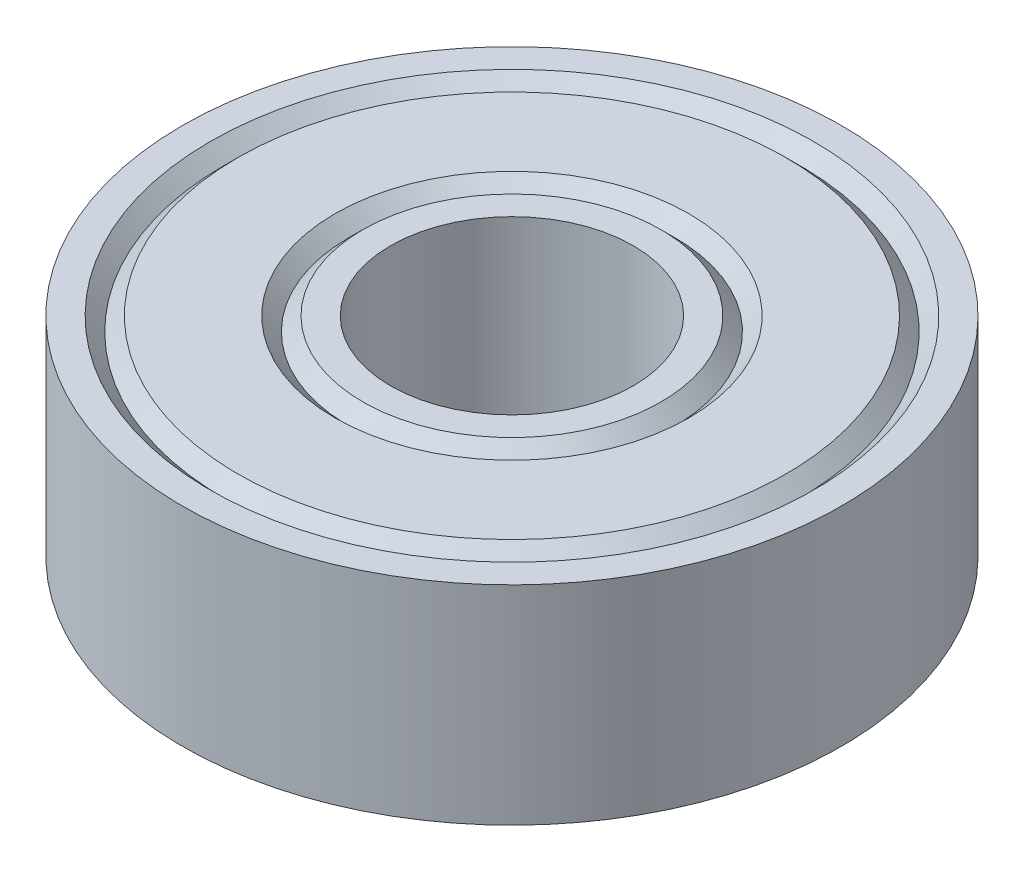
ISO-10303-21;
HEADER;
FILE_DESCRIPTION(('STEP AP214'),'2;1');
FILE_NAME('part.step','',(''),(''),'','','');
FILE_SCHEMA(('AUTOMOTIVE_DESIGN { 1 0 10303 214 1 1 1 1 }'));
ENDSEC;
DATA;
#1=APPLICATION_CONTEXT('core data for automotive mechanical design processes');
#2=APPLICATION_PROTOCOL_DEFINITION('international standard','automotive_design',2000,#1);
#3=PRODUCT_CONTEXT('',#1,'mechanical');
#4=PRODUCT('Part','Part','',(#3));
#5=PRODUCT_RELATED_PRODUCT_CATEGORY('part','',(#4));
#6=PRODUCT_DEFINITION_FORMATION('','',#4);
#7=PRODUCT_DEFINITION_CONTEXT('part definition',#1,'design');
#8=PRODUCT_DEFINITION('design','',#6,#7);
#9=PRODUCT_DEFINITION_SHAPE('','',#8);
#10=(LENGTH_UNIT() NAMED_UNIT(*) SI_UNIT(.MILLI.,.METRE.));
#11=(NAMED_UNIT(*) PLANE_ANGLE_UNIT() SI_UNIT($,.RADIAN.));
#12=(NAMED_UNIT(*) SI_UNIT($,.STERADIAN.) SOLID_ANGLE_UNIT());
#13=UNCERTAINTY_MEASURE_WITH_UNIT(LENGTH_MEASURE(1.E-05),#10,'distance_accuracy_value','');
#14=(GEOMETRIC_REPRESENTATION_CONTEXT(3) GLOBAL_UNCERTAINTY_ASSIGNED_CONTEXT((#13)) GLOBAL_UNIT_ASSIGNED_CONTEXT((#10,
#11,#12)) REPRESENTATION_CONTEXT('',''));
#15=CARTESIAN_POINT('',(0.,0.,0.));
#16=DIRECTION('',(0.,0.,1.));
#17=DIRECTION('',(1.,0.,0.));
#18=AXIS2_PLACEMENT_3D('',#15,#16,#17);
#19=CARTESIAN_POINT('',(0.,3.,0.));
#20=DIRECTION('',(0.,1.,0.));
#21=DIRECTION('',(-1.,0.,0.));
#22=AXIS2_PLACEMENT_3D('',#19,#20,#21);
#23=CYLINDRICAL_SURFACE('',#22,3.5);
#24=CARTESIAN_POINT('',(0.,3.,0.));
#25=DIRECTION('',(0.,1.,0.));
#26=DIRECTION('',(-1.,0.,0.));
#27=AXIS2_PLACEMENT_3D('',#24,#25,#26);
#28=CIRCLE('',#27,3.5);
#29=CARTESIAN_POINT('',(-3.5,3.,0.));
#30=VERTEX_POINT('',#29);
#31=EDGE_CURVE('E83',#30,#30,#28,.T.);
#32=ORIENTED_EDGE('',*,*,#31,.T.);
#33=EDGE_LOOP('',(#32));
#34=FACE_BOUND('',#33,.T.);
#35=CARTESIAN_POINT('',(0.,-3.,0.));
#36=DIRECTION('',(0.,1.,0.));
#37=DIRECTION('',(-1.,0.,0.));
#38=AXIS2_PLACEMENT_3D('',#35,#36,#37);
#39=CIRCLE('',#38,3.5);
#40=CARTESIAN_POINT('',(-3.5,-3.,0.));
#41=VERTEX_POINT('',#40);
#42=EDGE_CURVE('E10',#41,#41,#39,.T.);
#43=ORIENTED_EDGE('',*,*,#42,.F.);
#44=EDGE_LOOP('',(#43));
#45=FACE_BOUND('',#44,.T.);
#46=ADVANCED_FACE('F31',(#34,#45),#23,.F.);
#47=CARTESIAN_POINT('',(-3.5,-3.,0.));
#48=DIRECTION('',(0.,-1.,0.));
#49=DIRECTION('',(1.,0.,0.));
#50=AXIS2_PLACEMENT_3D('',#47,#48,#49);
#51=PLANE('',#50);
#52=ORIENTED_EDGE('',*,*,#42,.T.);
#53=EDGE_LOOP('',(#52));
#54=FACE_BOUND('',#53,.T.);
#55=CARTESIAN_POINT('',(0.,-3.,0.));
#56=DIRECTION('',(0.,1.,0.));
#57=DIRECTION('',(-1.,0.,0.));
#58=AXIS2_PLACEMENT_3D('',#55,#56,#57);
#59=CIRCLE('',#58,4.3);
#60=CARTESIAN_POINT('',(-4.3,-3.,0.));
#61=VERTEX_POINT('',#60);
#62=EDGE_CURVE('E37',#61,#61,#59,.T.);
#63=ORIENTED_EDGE('',*,*,#62,.F.);
#64=EDGE_LOOP('',(#63));
#65=FACE_BOUND('',#64,.T.);
#66=ADVANCED_FACE('F101',(#54,#65),#51,.T.);
#67=CARTESIAN_POINT('',(0.,-2.6,0.));
#68=DIRECTION('',(0.,1.,0.));
#69=DIRECTION('',(-1.,0.,0.));
#70=AXIS2_PLACEMENT_3D('',#67,#68,#69);
#71=CONICAL_SURFACE('',#70,4.7,0.785398163397449);
#72=ORIENTED_EDGE('',*,*,#62,.T.);
#73=EDGE_LOOP('',(#72));
#74=FACE_BOUND('',#73,.T.);
#75=CARTESIAN_POINT('',(0.,-2.6,0.));
#76=DIRECTION('',(0.,1.,0.));
#77=DIRECTION('',(-1.,0.,0.));
#78=AXIS2_PLACEMENT_3D('',#75,#76,#77);
#79=CIRCLE('',#78,4.7);
#80=CARTESIAN_POINT('',(-4.7,-2.6,0.));
#81=VERTEX_POINT('',#80);
#82=EDGE_CURVE('E41',#81,#81,#79,.T.);
#83=ORIENTED_EDGE('',*,*,#82,.F.);
#84=EDGE_LOOP('',(#83));
#85=FACE_BOUND('',#84,.T.);
#86=ADVANCED_FACE('F105',(#74,#85),#71,.T.);
#87=CARTESIAN_POINT('',(0.,-3.,0.));
#88=DIRECTION('',(0.,-1.,0.));
#89=DIRECTION('',(1.,0.,0.));
#90=AXIS2_PLACEMENT_3D('',#87,#88,#89);
#91=CONICAL_SURFACE('',#90,5.1,0.785398163397447);
#92=ORIENTED_EDGE('',*,*,#82,.T.);
#93=EDGE_LOOP('',(#92));
#94=FACE_BOUND('',#93,.T.);
#95=CARTESIAN_POINT('',(0.,-3.,0.));
#96=DIRECTION('',(0.,1.,0.));
#97=DIRECTION('',(-1.,0.,0.));
#98=AXIS2_PLACEMENT_3D('',#95,#96,#97);
#99=CIRCLE('',#98,5.1);
#100=CARTESIAN_POINT('',(-5.1,-3.,0.));
#101=VERTEX_POINT('',#100);
#102=EDGE_CURVE('E45',#101,#101,#99,.T.);
#103=ORIENTED_EDGE('',*,*,#102,.F.);
#104=EDGE_LOOP('',(#103));
#105=FACE_BOUND('',#104,.T.);
#106=ADVANCED_FACE('F109',(#94,#105),#91,.F.);
#107=CARTESIAN_POINT('',(-5.1,-3.,0.));
#108=DIRECTION('',(0.,-1.,0.));
#109=DIRECTION('',(1.,0.,0.));
#110=AXIS2_PLACEMENT_3D('',#107,#108,#109);
#111=PLANE('',#110);
#112=ORIENTED_EDGE('',*,*,#102,.T.);
#113=EDGE_LOOP('',(#112));
#114=FACE_BOUND('',#113,.T.);
#115=CARTESIAN_POINT('',(0.,-3.,0.));
#116=DIRECTION('',(0.,1.,0.));
#117=DIRECTION('',(-1.,0.,0.));
#118=AXIS2_PLACEMENT_3D('',#115,#116,#117);
#119=CIRCLE('',#118,7.9);
#120=CARTESIAN_POINT('',(-7.9,-3.,0.));
#121=VERTEX_POINT('',#120);
#122=EDGE_CURVE('E50',#121,#121,#119,.T.);
#123=ORIENTED_EDGE('',*,*,#122,.F.);
#124=EDGE_LOOP('',(#123));
#125=FACE_BOUND('',#124,.T.);
#126=ADVANCED_FACE('F115',(#114,#125),#111,.T.);
#127=CARTESIAN_POINT('',(0.,-2.6,0.));
#128=DIRECTION('',(0.,1.,0.));
#129=DIRECTION('',(-1.,0.,0.));
#130=AXIS2_PLACEMENT_3D('',#127,#128,#129);
#131=CONICAL_SURFACE('',#130,8.3,0.785398163397453);
#132=ORIENTED_EDGE('',*,*,#122,.T.);
#133=EDGE_LOOP('',(#132));
#134=FACE_BOUND('',#133,.T.);
#135=CARTESIAN_POINT('',(0.,-2.6,0.));
#136=DIRECTION('',(0.,1.,0.));
#137=DIRECTION('',(-1.,0.,0.));
#138=AXIS2_PLACEMENT_3D('',#135,#136,#137);
#139=CIRCLE('',#138,8.3);
#140=CARTESIAN_POINT('',(-8.3,-2.6,0.));
#141=VERTEX_POINT('',#140);
#142=EDGE_CURVE('E53',#141,#141,#139,.T.);
#143=ORIENTED_EDGE('',*,*,#142,.F.);
#144=EDGE_LOOP('',(#143));
#145=FACE_BOUND('',#144,.T.);
#146=ADVANCED_FACE('F119',(#134,#145),#131,.T.);
#147=CARTESIAN_POINT('',(0.,-3.,0.));
#148=DIRECTION('',(0.,-1.,0.));
#149=DIRECTION('',(1.,0.,0.));
#150=AXIS2_PLACEMENT_3D('',#147,#148,#149);
#151=CONICAL_SURFACE('',#150,8.69999999999999,0.785398163397445);
#152=ORIENTED_EDGE('',*,*,#142,.T.);
#153=EDGE_LOOP('',(#152));
#154=FACE_BOUND('',#153,.T.);
#155=CARTESIAN_POINT('',(0.,-3.,0.));
#156=DIRECTION('',(0.,1.,0.));
#157=DIRECTION('',(-1.,0.,0.));
#158=AXIS2_PLACEMENT_3D('',#155,#156,#157);
#159=CIRCLE('',#158,8.7);
#160=CARTESIAN_POINT('',(-8.7,-3.,0.));
#161=VERTEX_POINT('',#160);
#162=EDGE_CURVE('E56',#161,#161,#159,.T.);
#163=ORIENTED_EDGE('',*,*,#162,.F.);
#164=EDGE_LOOP('',(#163));
#165=FACE_BOUND('',#164,.T.);
#166=ADVANCED_FACE('F123',(#154,#165),#151,.F.);
#167=CARTESIAN_POINT('',(-8.7,-3.,0.));
#168=DIRECTION('',(0.,-1.,0.));
#169=DIRECTION('',(1.,0.,0.));
#170=AXIS2_PLACEMENT_3D('',#167,#168,#169);
#171=PLANE('',#170);
#172=ORIENTED_EDGE('',*,*,#162,.T.);
#173=EDGE_LOOP('',(#172));
#174=FACE_BOUND('',#173,.T.);
#175=CARTESIAN_POINT('',(0.,-3.,0.));
#176=DIRECTION('',(0.,1.,0.));
#177=DIRECTION('',(-1.,0.,0.));
#178=AXIS2_PLACEMENT_3D('',#175,#176,#177);
#179=CIRCLE('',#178,9.5);
#180=CARTESIAN_POINT('',(-9.5,-3.,0.));
#181=VERTEX_POINT('',#180);
#182=EDGE_CURVE('E59',#181,#181,#179,.T.);
#183=ORIENTED_EDGE('',*,*,#182,.F.);
#184=EDGE_LOOP('',(#183));
#185=FACE_BOUND('',#184,.T.);
#186=ADVANCED_FACE('F127',(#174,#185),#171,.T.);
#187=CARTESIAN_POINT('',(0.,3.,0.));
#188=DIRECTION('',(0.,1.,0.));
#189=DIRECTION('',(-1.,0.,0.));
#190=AXIS2_PLACEMENT_3D('',#187,#188,#189);
#191=CYLINDRICAL_SURFACE('',#190,9.49999999999999);
#192=ORIENTED_EDGE('',*,*,#182,.T.);
#193=EDGE_LOOP('',(#192));
#194=FACE_BOUND('',#193,.T.);
#195=CARTESIAN_POINT('',(0.,3.,0.));
#196=DIRECTION('',(0.,1.,0.));
#197=DIRECTION('',(-1.,0.,0.));
#198=AXIS2_PLACEMENT_3D('',#195,#196,#197);
#199=CIRCLE('',#198,9.5);
#200=CARTESIAN_POINT('',(-9.5,3.,0.));
#201=VERTEX_POINT('',#200);
#202=EDGE_CURVE('E62',#201,#201,#199,.T.);
#203=ORIENTED_EDGE('',*,*,#202,.F.);
#204=EDGE_LOOP('',(#203));
#205=FACE_BOUND('',#204,.T.);
#206=ADVANCED_FACE('F131',(#194,#205),#191,.T.);
#207=CARTESIAN_POINT('',(-8.7,3.,0.));
#208=DIRECTION('',(0.,1.,0.));
#209=DIRECTION('',(-1.,0.,0.));
#210=AXIS2_PLACEMENT_3D('',#207,#208,#209);
#211=PLANE('',#210);
#212=ORIENTED_EDGE('',*,*,#202,.T.);
#213=EDGE_LOOP('',(#212));
#214=FACE_BOUND('',#213,.T.);
#215=CARTESIAN_POINT('',(0.,3.,0.));
#216=DIRECTION('',(0.,1.,0.));
#217=DIRECTION('',(-1.,0.,0.));
#218=AXIS2_PLACEMENT_3D('',#215,#216,#217);
#219=CIRCLE('',#218,8.7);
#220=CARTESIAN_POINT('',(-8.7,3.,0.));
#221=VERTEX_POINT('',#220);
#222=EDGE_CURVE('E65',#221,#221,#219,.T.);
#223=ORIENTED_EDGE('',*,*,#222,.F.);
#224=EDGE_LOOP('',(#223));
#225=FACE_BOUND('',#224,.T.);
#226=ADVANCED_FACE('F135',(#214,#225),#211,.T.);
#227=CARTESIAN_POINT('',(0.,2.6,0.));
#228=DIRECTION('',(0.,1.,0.));
#229=DIRECTION('',(-1.,0.,0.));
#230=AXIS2_PLACEMENT_3D('',#227,#228,#229);
#231=CONICAL_SURFACE('',#230,8.3,0.785398163397447);
#232=ORIENTED_EDGE('',*,*,#222,.T.);
#233=EDGE_LOOP('',(#232));
#234=FACE_BOUND('',#233,.T.);
#235=CARTESIAN_POINT('',(0.,2.6,0.));
#236=DIRECTION('',(0.,1.,0.));
#237=DIRECTION('',(-1.,0.,0.));
#238=AXIS2_PLACEMENT_3D('',#235,#236,#237);
#239=CIRCLE('',#238,8.3);
#240=CARTESIAN_POINT('',(-8.3,2.6,0.));
#241=VERTEX_POINT('',#240);
#242=EDGE_CURVE('E68',#241,#241,#239,.T.);
#243=ORIENTED_EDGE('',*,*,#242,.F.);
#244=EDGE_LOOP('',(#243));
#245=FACE_BOUND('',#244,.T.);
#246=ADVANCED_FACE('F139',(#234,#245),#231,.F.);
#247=CARTESIAN_POINT('',(0.,3.,0.));
#248=DIRECTION('',(0.,-1.,0.));
#249=DIRECTION('',(1.,0.,0.));
#250=AXIS2_PLACEMENT_3D('',#247,#248,#249);
#251=CONICAL_SURFACE('',#250,7.9,0.785398163397449);
#252=ORIENTED_EDGE('',*,*,#242,.T.);
#253=EDGE_LOOP('',(#252));
#254=FACE_BOUND('',#253,.T.);
#255=CARTESIAN_POINT('',(0.,3.,0.));
#256=DIRECTION('',(0.,1.,0.));
#257=DIRECTION('',(-1.,0.,0.));
#258=AXIS2_PLACEMENT_3D('',#255,#256,#257);
#259=CIRCLE('',#258,7.9);
#260=CARTESIAN_POINT('',(-7.9,3.,0.));
#261=VERTEX_POINT('',#260);
#262=EDGE_CURVE('E71',#261,#261,#259,.T.);
#263=ORIENTED_EDGE('',*,*,#262,.F.);
#264=EDGE_LOOP('',(#263));
#265=FACE_BOUND('',#264,.T.);
#266=ADVANCED_FACE('F143',(#254,#265),#251,.T.);
#267=CARTESIAN_POINT('',(-5.1,3.,0.));
#268=DIRECTION('',(0.,1.,0.));
#269=DIRECTION('',(-1.,0.,0.));
#270=AXIS2_PLACEMENT_3D('',#267,#268,#269);
#271=PLANE('',#270);
#272=ORIENTED_EDGE('',*,*,#262,.T.);
#273=EDGE_LOOP('',(#272));
#274=FACE_BOUND('',#273,.T.);
#275=CARTESIAN_POINT('',(0.,3.,0.));
#276=DIRECTION('',(0.,1.,0.));
#277=DIRECTION('',(-1.,0.,0.));
#278=AXIS2_PLACEMENT_3D('',#275,#276,#277);
#279=CIRCLE('',#278,5.1);
#280=CARTESIAN_POINT('',(-5.1,3.,0.));
#281=VERTEX_POINT('',#280);
#282=EDGE_CURVE('E74',#281,#281,#279,.T.);
#283=ORIENTED_EDGE('',*,*,#282,.F.);
#284=EDGE_LOOP('',(#283));
#285=FACE_BOUND('',#284,.T.);
#286=ADVANCED_FACE('F147',(#274,#285),#271,.T.);
#287=CARTESIAN_POINT('',(0.,2.6,0.));
#288=DIRECTION('',(0.,1.,0.));
#289=DIRECTION('',(-1.,0.,0.));
#290=AXIS2_PLACEMENT_3D('',#287,#288,#289);
#291=CONICAL_SURFACE('',#290,4.7,0.785398163397448);
#292=ORIENTED_EDGE('',*,*,#282,.T.);
#293=EDGE_LOOP('',(#292));
#294=FACE_BOUND('',#293,.T.);
#295=CARTESIAN_POINT('',(0.,2.6,0.));
#296=DIRECTION('',(0.,1.,0.));
#297=DIRECTION('',(-1.,0.,0.));
#298=AXIS2_PLACEMENT_3D('',#295,#296,#297);
#299=CIRCLE('',#298,4.7);
#300=CARTESIAN_POINT('',(-4.7,2.6,0.));
#301=VERTEX_POINT('',#300);
#302=EDGE_CURVE('E77',#301,#301,#299,.T.);
#303=ORIENTED_EDGE('',*,*,#302,.F.);
#304=EDGE_LOOP('',(#303));
#305=FACE_BOUND('',#304,.T.);
#306=ADVANCED_FACE('F97',(#294,#305),#291,.F.);
#307=CARTESIAN_POINT('',(0.,3.,0.));
#308=DIRECTION('',(0.,-1.,0.));
#309=DIRECTION('',(1.,0.,0.));
#310=AXIS2_PLACEMENT_3D('',#307,#308,#309);
#311=CONICAL_SURFACE('',#310,4.3,0.785398163397446);
#312=ORIENTED_EDGE('',*,*,#302,.T.);
#313=EDGE_LOOP('',(#312));
#314=FACE_BOUND('',#313,.T.);
#315=CARTESIAN_POINT('',(0.,3.,0.));
#316=DIRECTION('',(0.,1.,0.));
#317=DIRECTION('',(-1.,0.,0.));
#318=AXIS2_PLACEMENT_3D('',#315,#316,#317);
#319=CIRCLE('',#318,4.3);
#320=CARTESIAN_POINT('',(-4.3,3.,0.));
#321=VERTEX_POINT('',#320);
#322=EDGE_CURVE('E80',#321,#321,#319,.T.);
#323=ORIENTED_EDGE('',*,*,#322,.F.);
#324=EDGE_LOOP('',(#323));
#325=FACE_BOUND('',#324,.T.);
#326=ADVANCED_FACE('F91',(#314,#325),#311,.T.);
#327=CARTESIAN_POINT('',(-3.5,3.,0.));
#328=DIRECTION('',(0.,1.,0.));
#329=DIRECTION('',(-1.,0.,0.));
#330=AXIS2_PLACEMENT_3D('',#327,#328,#329);
#331=PLANE('',#330);
#332=ORIENTED_EDGE('',*,*,#322,.T.);
#333=EDGE_LOOP('',(#332));
#334=FACE_BOUND('',#333,.T.);
#335=ORIENTED_EDGE('',*,*,#31,.F.);
#336=EDGE_LOOP('',(#335));
#337=FACE_BOUND('',#336,.T.);
#338=ADVANCED_FACE('F89',(#334,#337),#331,.T.);
#339=CLOSED_SHELL('',(#46,#66,#86,#106,#126,#146,#166,#186,#206,#226,#246,#266,#286,#306,#326,#338));
#340=MANIFOLD_SOLID_BREP('B2',#339);
#341=ADVANCED_BREP_SHAPE_REPRESENTATION('',(#18,#340),#14);
#342=SHAPE_DEFINITION_REPRESENTATION(#9,#341);
ENDSEC;
END-ISO-10303-21;
